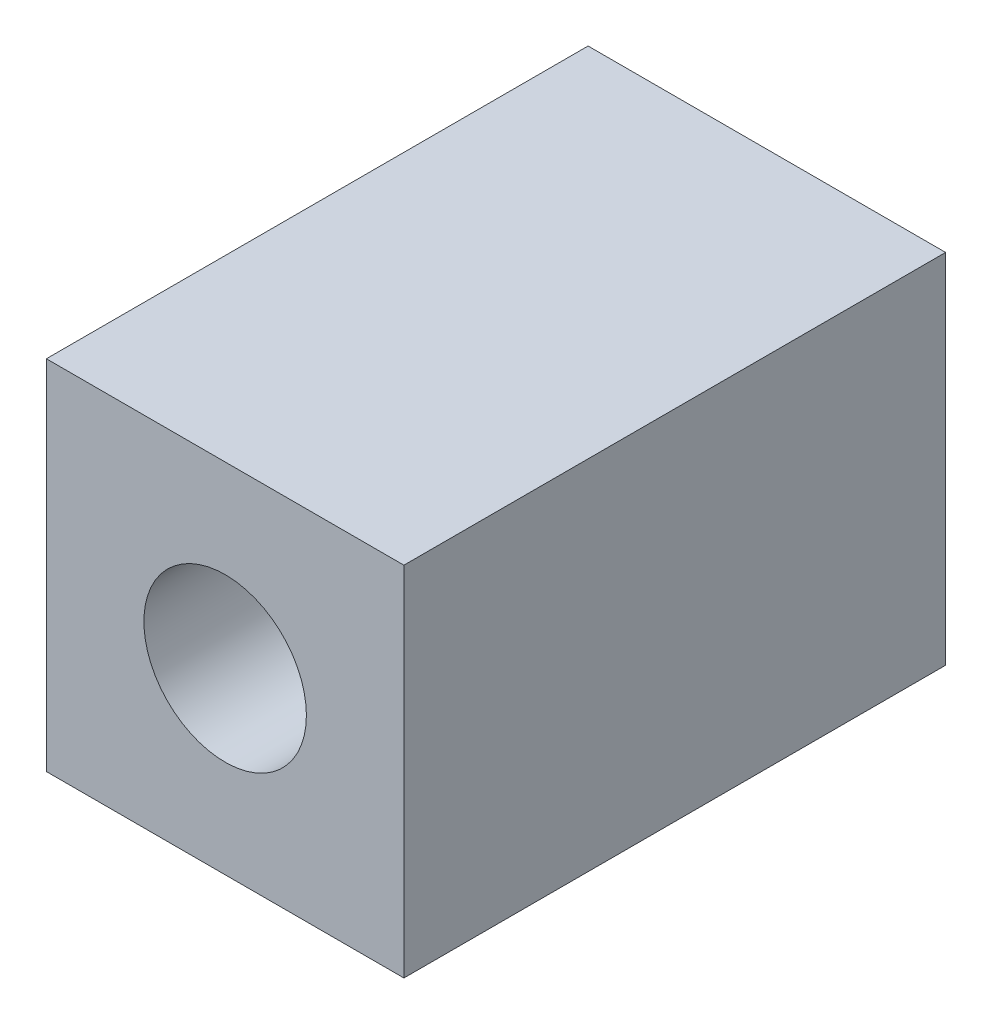
ISO-10303-21;
HEADER;
FILE_DESCRIPTION(('STEP AP214'),'2;1');
FILE_NAME('part.step','',(''),(''),'','','');
FILE_SCHEMA(('AUTOMOTIVE_DESIGN { 1 0 10303 214 1 1 1 1 }'));
ENDSEC;
DATA;
#1=APPLICATION_CONTEXT('core data for automotive mechanical design processes');
#2=APPLICATION_PROTOCOL_DEFINITION('international standard','automotive_design',2000,#1);
#3=PRODUCT_CONTEXT('',#1,'mechanical');
#4=PRODUCT('Part','Part','',(#3));
#5=PRODUCT_RELATED_PRODUCT_CATEGORY('part','',(#4));
#6=PRODUCT_DEFINITION_FORMATION('','',#4);
#7=PRODUCT_DEFINITION_CONTEXT('part definition',#1,'design');
#8=PRODUCT_DEFINITION('design','',#6,#7);
#9=PRODUCT_DEFINITION_SHAPE('','',#8);
#10=(LENGTH_UNIT() NAMED_UNIT(*) SI_UNIT(.MILLI.,.METRE.));
#11=(NAMED_UNIT(*) PLANE_ANGLE_UNIT() SI_UNIT($,.RADIAN.));
#12=(NAMED_UNIT(*) SI_UNIT($,.STERADIAN.) SOLID_ANGLE_UNIT());
#13=UNCERTAINTY_MEASURE_WITH_UNIT(LENGTH_MEASURE(1.E-05),#10,'distance_accuracy_value','');
#14=(GEOMETRIC_REPRESENTATION_CONTEXT(3) GLOBAL_UNCERTAINTY_ASSIGNED_CONTEXT((#13)) GLOBAL_UNIT_ASSIGNED_CONTEXT((#10,
#11,#12)) REPRESENTATION_CONTEXT('',''));
#15=CARTESIAN_POINT('',(0.,0.,0.));
#16=DIRECTION('',(0.,0.,1.));
#17=DIRECTION('',(1.,0.,0.));
#18=AXIS2_PLACEMENT_3D('',#15,#16,#17);
#19=CARTESIAN_POINT('',(-20.8921237018409,4.38053097345133,10.));
#20=DIRECTION('',(1.,0.,0.));
#21=DIRECTION('',(0.,0.,-1.));
#22=AXIS2_PLACEMENT_3D('',#19,#20,#21);
#23=PLANE('',#22);
#24=DIRECTION('',(0.,-1.,0.));
#25=VECTOR('',#24,1.);
#26=CARTESIAN_POINT('',(-20.8921237018409,4.38053097345133,0.));
#27=LINE('',#26,#25);
#28=CARTESIAN_POINT('',(-20.8921237018409,4.38053097345133,0.));
#29=VERTEX_POINT('',#28);
#30=CARTESIAN_POINT('',(-20.8921237018409,-2.21946902654867,0.));
#31=VERTEX_POINT('',#30);
#32=EDGE_CURVE('E148',#29,#31,#27,.T.);
#33=ORIENTED_EDGE('',*,*,#32,.T.);
#34=DIRECTION('',(0.,0.,-1.));
#35=VECTOR('',#34,1.);
#36=CARTESIAN_POINT('',(-20.8921237018409,-2.21946902654867,10.));
#37=LINE('',#36,#35);
#38=CARTESIAN_POINT('',(-20.8921237018409,-2.21946902654867,10.));
#39=VERTEX_POINT('',#38);
#40=EDGE_CURVE('E11',#39,#31,#37,.T.);
#41=ORIENTED_EDGE('',*,*,#40,.F.);
#42=DIRECTION('',(0.,-1.,0.));
#43=VECTOR('',#42,1.);
#44=CARTESIAN_POINT('',(-20.8921237018409,4.38053097345133,10.));
#45=LINE('',#44,#43);
#46=CARTESIAN_POINT('',(-20.8921237018409,4.38053097345133,10.));
#47=VERTEX_POINT('',#46);
#48=EDGE_CURVE('E151',#47,#39,#45,.T.);
#49=ORIENTED_EDGE('',*,*,#48,.F.);
#50=DIRECTION('',(0.,0.,-1.));
#51=VECTOR('',#50,1.);
#52=CARTESIAN_POINT('',(-20.8921237018409,4.38053097345133,10.));
#53=LINE('',#52,#51);
#54=EDGE_CURVE('E157',#47,#29,#53,.T.);
#55=ORIENTED_EDGE('',*,*,#54,.T.);
#56=EDGE_LOOP('',(#33,#41,#49,#55));
#57=FACE_BOUND('',#56,.T.);
#58=ADVANCED_FACE('F33',(#57),#23,.F.);
#59=CARTESIAN_POINT('',(-20.8921237018409,-2.21946902654867,10.));
#60=DIRECTION('',(0.,1.,0.));
#61=DIRECTION('',(0.,0.,1.));
#62=AXIS2_PLACEMENT_3D('',#59,#60,#61);
#63=PLANE('',#62);
#64=DIRECTION('',(1.,0.,0.));
#65=VECTOR('',#64,1.);
#66=CARTESIAN_POINT('',(-20.8921237018409,-2.21946902654867,0.));
#67=LINE('',#66,#65);
#68=CARTESIAN_POINT('',(-14.2921237018409,-2.21946902654867,0.));
#69=VERTEX_POINT('',#68);
#70=EDGE_CURVE('E160',#31,#69,#67,.T.);
#71=ORIENTED_EDGE('',*,*,#70,.T.);
#72=DIRECTION('',(0.,0.,-1.));
#73=VECTOR('',#72,1.);
#74=CARTESIAN_POINT('',(-14.2921237018409,-2.21946902654867,10.));
#75=LINE('',#74,#73);
#76=CARTESIAN_POINT('',(-14.2921237018409,-2.21946902654867,10.));
#77=VERTEX_POINT('',#76);
#78=EDGE_CURVE('E40',#77,#69,#75,.T.);
#79=ORIENTED_EDGE('',*,*,#78,.F.);
#80=DIRECTION('',(1.,0.,0.));
#81=VECTOR('',#80,1.);
#82=CARTESIAN_POINT('',(-20.8921237018409,-2.21946902654867,10.));
#83=LINE('',#82,#81);
#84=EDGE_CURVE('E84',#39,#77,#83,.T.);
#85=ORIENTED_EDGE('',*,*,#84,.F.);
#86=ORIENTED_EDGE('',*,*,#40,.T.);
#87=EDGE_LOOP('',(#71,#79,#85,#86));
#88=FACE_BOUND('',#87,.T.);
#89=ADVANCED_FACE('F189',(#88),#63,.F.);
#90=CARTESIAN_POINT('',(-14.2921237018409,4.38053097345133,10.));
#91=DIRECTION('',(-1.,0.,0.));
#92=DIRECTION('',(0.,-1.,0.));
#93=AXIS2_PLACEMENT_3D('',#90,#91,#92);
#94=PLANE('',#93);
#95=DIRECTION('',(0.,1.,0.));
#96=VECTOR('',#95,1.);
#97=CARTESIAN_POINT('',(-14.2921237018409,4.38053097345133,0.));
#98=LINE('',#97,#96);
#99=CARTESIAN_POINT('',(-14.2921237018409,4.38053097345133,0.));
#100=VERTEX_POINT('',#99);
#101=EDGE_CURVE('E162',#69,#100,#98,.T.);
#102=ORIENTED_EDGE('',*,*,#101,.T.);
#103=DIRECTION('',(0.,0.,-1.));
#104=VECTOR('',#103,1.);
#105=CARTESIAN_POINT('',(-14.2921237018409,4.38053097345133,10.));
#106=LINE('',#105,#104);
#107=CARTESIAN_POINT('',(-14.2921237018409,4.38053097345133,10.));
#108=VERTEX_POINT('',#107);
#109=EDGE_CURVE('E166',#108,#100,#106,.T.);
#110=ORIENTED_EDGE('',*,*,#109,.F.);
#111=DIRECTION('',(0.,1.,0.));
#112=VECTOR('',#111,1.);
#113=CARTESIAN_POINT('',(-14.2921237018409,4.38053097345133,10.));
#114=LINE('',#113,#112);
#115=EDGE_CURVE('E154',#77,#108,#114,.T.);
#116=ORIENTED_EDGE('',*,*,#115,.F.);
#117=ORIENTED_EDGE('',*,*,#78,.T.);
#118=EDGE_LOOP('',(#102,#110,#116,#117));
#119=FACE_BOUND('',#118,.T.);
#120=ADVANCED_FACE('F171',(#119),#94,.F.);
#121=CARTESIAN_POINT('',(-20.8921237018409,4.38053097345133,10.));
#122=DIRECTION('',(0.,-1.,0.));
#123=DIRECTION('',(0.,0.,-1.));
#124=AXIS2_PLACEMENT_3D('',#121,#122,#123);
#125=PLANE('',#124);
#126=DIRECTION('',(-1.,0.,0.));
#127=VECTOR('',#126,1.);
#128=CARTESIAN_POINT('',(-20.8921237018409,4.38053097345133,0.));
#129=LINE('',#128,#127);
#130=EDGE_CURVE('E77',#100,#29,#129,.T.);
#131=ORIENTED_EDGE('',*,*,#130,.T.);
#132=ORIENTED_EDGE('',*,*,#54,.F.);
#133=DIRECTION('',(-1.,0.,0.));
#134=VECTOR('',#133,1.);
#135=CARTESIAN_POINT('',(-20.8921237018409,4.38053097345133,10.));
#136=LINE('',#135,#134);
#137=EDGE_CURVE('E56',#108,#47,#136,.T.);
#138=ORIENTED_EDGE('',*,*,#137,.F.);
#139=ORIENTED_EDGE('',*,*,#109,.T.);
#140=EDGE_LOOP('',(#131,#132,#138,#139));
#141=FACE_BOUND('',#140,.T.);
#142=ADVANCED_FACE('F179',(#141),#125,.F.);
#143=CARTESIAN_POINT('',(0.,0.,10.));
#144=DIRECTION('',(0.,0.,1.));
#145=DIRECTION('',(1.,0.,0.));
#146=AXIS2_PLACEMENT_3D('',#143,#144,#145);
#147=PLANE('',#146);
#148=CARTESIAN_POINT('',(-17.5921237018409,1.08053097345133,10.));
#149=DIRECTION('',(0.,0.,1.));
#150=DIRECTION('',(1.,0.,0.));
#151=AXIS2_PLACEMENT_3D('',#148,#149,#150);
#152=CIRCLE('',#151,1.5);
#153=CARTESIAN_POINT('',(-16.0921237018409,1.08053097345133,10.));
#154=VERTEX_POINT('',#153);
#155=EDGE_CURVE('E141',#154,#154,#152,.T.);
#156=ORIENTED_EDGE('',*,*,#155,.F.);
#157=EDGE_LOOP('',(#156));
#158=FACE_BOUND('',#157,.T.);
#159=ORIENTED_EDGE('',*,*,#48,.T.);
#160=ORIENTED_EDGE('',*,*,#84,.T.);
#161=ORIENTED_EDGE('',*,*,#115,.T.);
#162=ORIENTED_EDGE('',*,*,#137,.T.);
#163=EDGE_LOOP('',(#159,#160,#161,#162));
#164=FACE_BOUND('',#163,.T.);
#165=ADVANCED_FACE('F181',(#158,#164),#147,.T.);
#166=CARTESIAN_POINT('',(0.,0.,0.));
#167=DIRECTION('',(0.,0.,1.));
#168=DIRECTION('',(1.,0.,0.));
#169=AXIS2_PLACEMENT_3D('',#166,#167,#168);
#170=PLANE('',#169);
#171=DIRECTION('',(1.,0.,0.));
#172=VECTOR('',#171,1.);
#173=CARTESIAN_POINT('',(-15.9921237018409,2.68053097345133,0.));
#174=LINE('',#173,#172);
#175=CARTESIAN_POINT('',(-19.1921237018409,2.68053097345133,0.));
#176=VERTEX_POINT('',#175);
#177=CARTESIAN_POINT('',(-15.9921237018409,2.68053097345133,0.));
#178=VERTEX_POINT('',#177);
#179=EDGE_CURVE('E135',#176,#178,#174,.T.);
#180=ORIENTED_EDGE('',*,*,#179,.F.);
#181=DIRECTION('',(0.,1.,0.));
#182=VECTOR('',#181,1.);
#183=CARTESIAN_POINT('',(-19.1921237018409,2.68053097345133,0.));
#184=LINE('',#183,#182);
#185=CARTESIAN_POINT('',(-19.1921237018409,-0.519469026548671,0.));
#186=VERTEX_POINT('',#185);
#187=EDGE_CURVE('E47',#186,#176,#184,.T.);
#188=ORIENTED_EDGE('',*,*,#187,.F.);
#189=DIRECTION('',(-1.,0.,0.));
#190=VECTOR('',#189,1.);
#191=CARTESIAN_POINT('',(-15.9921237018409,-0.519469026548671,0.));
#192=LINE('',#191,#190);
#193=CARTESIAN_POINT('',(-15.9921237018409,-0.519469026548671,0.));
#194=VERTEX_POINT('',#193);
#195=EDGE_CURVE('E126',#194,#186,#192,.T.);
#196=ORIENTED_EDGE('',*,*,#195,.F.);
#197=DIRECTION('',(0.,-1.,0.));
#198=VECTOR('',#197,1.);
#199=CARTESIAN_POINT('',(-15.9921237018409,2.68053097345133,0.));
#200=LINE('',#199,#198);
#201=EDGE_CURVE('E129',#178,#194,#200,.T.);
#202=ORIENTED_EDGE('',*,*,#201,.F.);
#203=EDGE_LOOP('',(#180,#188,#196,#202));
#204=FACE_BOUND('',#203,.T.);
#205=ORIENTED_EDGE('',*,*,#32,.F.);
#206=ORIENTED_EDGE('',*,*,#130,.F.);
#207=ORIENTED_EDGE('',*,*,#101,.F.);
#208=ORIENTED_EDGE('',*,*,#70,.F.);
#209=EDGE_LOOP('',(#205,#206,#207,#208));
#210=FACE_BOUND('',#209,.T.);
#211=ADVANCED_FACE('F175',(#204,#210),#170,.F.);
#212=CARTESIAN_POINT('',(-17.5921237018409,1.08053097345133,6.));
#213=DIRECTION('',(0.,0.,1.));
#214=DIRECTION('',(1.,0.,0.));
#215=AXIS2_PLACEMENT_3D('',#212,#213,#214);
#216=CYLINDRICAL_SURFACE('',#215,1.5);
#217=CARTESIAN_POINT('',(-17.5921237018409,1.08053097345133,6.));
#218=DIRECTION('',(0.,0.,1.));
#219=DIRECTION('',(1.,0.,0.));
#220=AXIS2_PLACEMENT_3D('',#217,#218,#219);
#221=CIRCLE('',#220,1.5);
#222=CARTESIAN_POINT('',(-16.0921237018409,1.08053097345133,6.));
#223=VERTEX_POINT('',#222);
#224=EDGE_CURVE('E145',#223,#223,#221,.T.);
#225=ORIENTED_EDGE('',*,*,#224,.F.);
#226=EDGE_LOOP('',(#225));
#227=FACE_BOUND('',#226,.T.);
#228=ORIENTED_EDGE('',*,*,#155,.T.);
#229=EDGE_LOOP('',(#228));
#230=FACE_BOUND('',#229,.T.);
#231=ADVANCED_FACE('F219',(#227,#230),#216,.F.);
#232=CARTESIAN_POINT('',(-17.5921237018409,1.08053097345133,6.));
#233=DIRECTION('',(0.,0.,1.));
#234=DIRECTION('',(1.,0.,0.));
#235=AXIS2_PLACEMENT_3D('',#232,#233,#234);
#236=PLANE('',#235);
#237=ORIENTED_EDGE('',*,*,#224,.T.);
#238=EDGE_LOOP('',(#237));
#239=FACE_BOUND('',#238,.T.);
#240=ADVANCED_FACE('F224',(#239),#236,.T.);
#241=CARTESIAN_POINT('',(-19.1921237018409,2.68053097345133,4.));
#242=DIRECTION('',(-1.,0.,0.));
#243=DIRECTION('',(0.,0.,1.));
#244=AXIS2_PLACEMENT_3D('',#241,#242,#243);
#245=PLANE('',#244);
#246=ORIENTED_EDGE('',*,*,#187,.T.);
#247=DIRECTION('',(0.,0.,-1.));
#248=VECTOR('',#247,1.);
#249=CARTESIAN_POINT('',(-19.1921237018409,2.68053097345133,4.));
#250=LINE('',#249,#248);
#251=CARTESIAN_POINT('',(-19.1921237018409,2.68053097345133,4.));
#252=VERTEX_POINT('',#251);
#253=EDGE_CURVE('E104',#252,#176,#250,.T.);
#254=ORIENTED_EDGE('',*,*,#253,.F.);
#255=DIRECTION('',(0.,1.,0.));
#256=VECTOR('',#255,1.);
#257=CARTESIAN_POINT('',(-19.1921237018409,2.68053097345133,4.));
#258=LINE('',#257,#256);
#259=CARTESIAN_POINT('',(-19.1921237018409,-0.519469026548671,4.));
#260=VERTEX_POINT('',#259);
#261=EDGE_CURVE('E108',#260,#252,#258,.T.);
#262=ORIENTED_EDGE('',*,*,#261,.F.);
#263=DIRECTION('',(0.,0.,-1.));
#264=VECTOR('',#263,1.);
#265=CARTESIAN_POINT('',(-19.1921237018409,-0.519469026548671,4.));
#266=LINE('',#265,#264);
#267=EDGE_CURVE('E139',#260,#186,#266,.T.);
#268=ORIENTED_EDGE('',*,*,#267,.T.);
#269=EDGE_LOOP('',(#246,#254,#262,#268));
#270=FACE_BOUND('',#269,.T.);
#271=ADVANCED_FACE('F106',(#270),#245,.F.);
#272=CARTESIAN_POINT('',(-15.9921237018409,-0.519469026548671,4.));
#273=DIRECTION('',(0.,-1.,0.));
#274=DIRECTION('',(0.,0.,-1.));
#275=AXIS2_PLACEMENT_3D('',#272,#273,#274);
#276=PLANE('',#275);
#277=ORIENTED_EDGE('',*,*,#195,.T.);
#278=ORIENTED_EDGE('',*,*,#267,.F.);
#279=DIRECTION('',(-1.,0.,0.));
#280=VECTOR('',#279,1.);
#281=CARTESIAN_POINT('',(-15.9921237018409,-0.519469026548671,4.));
#282=LINE('',#281,#280);
#283=CARTESIAN_POINT('',(-15.9921237018409,-0.519469026548671,4.));
#284=VERTEX_POINT('',#283);
#285=EDGE_CURVE('E114',#284,#260,#282,.T.);
#286=ORIENTED_EDGE('',*,*,#285,.F.);
#287=DIRECTION('',(0.,0.,-1.));
#288=VECTOR('',#287,1.);
#289=CARTESIAN_POINT('',(-15.9921237018409,-0.519469026548671,4.));
#290=LINE('',#289,#288);
#291=EDGE_CURVE('E142',#284,#194,#290,.T.);
#292=ORIENTED_EDGE('',*,*,#291,.T.);
#293=EDGE_LOOP('',(#277,#278,#286,#292));
#294=FACE_BOUND('',#293,.T.);
#295=ADVANCED_FACE('F249',(#294),#276,.F.);
#296=CARTESIAN_POINT('',(-15.9921237018409,2.68053097345133,4.));
#297=DIRECTION('',(1.,0.,0.));
#298=DIRECTION('',(0.,0.,-1.));
#299=AXIS2_PLACEMENT_3D('',#296,#297,#298);
#300=PLANE('',#299);
#301=ORIENTED_EDGE('',*,*,#201,.T.);
#302=ORIENTED_EDGE('',*,*,#291,.F.);
#303=DIRECTION('',(0.,-1.,0.));
#304=VECTOR('',#303,1.);
#305=CARTESIAN_POINT('',(-15.9921237018409,2.68053097345133,4.));
#306=LINE('',#305,#304);
#307=CARTESIAN_POINT('',(-15.9921237018409,2.68053097345133,4.));
#308=VERTEX_POINT('',#307);
#309=EDGE_CURVE('E122',#308,#284,#306,.T.);
#310=ORIENTED_EDGE('',*,*,#309,.F.);
#311=DIRECTION('',(0.,0.,-1.));
#312=VECTOR('',#311,1.);
#313=CARTESIAN_POINT('',(-15.9921237018409,2.68053097345133,4.));
#314=LINE('',#313,#312);
#315=EDGE_CURVE('E113',#308,#178,#314,.T.);
#316=ORIENTED_EDGE('',*,*,#315,.T.);
#317=EDGE_LOOP('',(#301,#302,#310,#316));
#318=FACE_BOUND('',#317,.T.);
#319=ADVANCED_FACE('F258',(#318),#300,.F.);
#320=CARTESIAN_POINT('',(-15.9921237018409,2.68053097345133,4.));
#321=DIRECTION('',(0.,1.,0.));
#322=DIRECTION('',(0.,0.,1.));
#323=AXIS2_PLACEMENT_3D('',#320,#321,#322);
#324=PLANE('',#323);
#325=ORIENTED_EDGE('',*,*,#179,.T.);
#326=ORIENTED_EDGE('',*,*,#315,.F.);
#327=DIRECTION('',(1.,0.,0.));
#328=VECTOR('',#327,1.);
#329=CARTESIAN_POINT('',(-15.9921237018409,2.68053097345133,4.));
#330=LINE('',#329,#328);
#331=EDGE_CURVE('E117',#252,#308,#330,.T.);
#332=ORIENTED_EDGE('',*,*,#331,.F.);
#333=ORIENTED_EDGE('',*,*,#253,.T.);
#334=EDGE_LOOP('',(#325,#326,#332,#333));
#335=FACE_BOUND('',#334,.T.);
#336=ADVANCED_FACE('F118',(#335),#324,.F.);
#337=CARTESIAN_POINT('',(0.,0.,4.));
#338=DIRECTION('',(0.,0.,-1.));
#339=DIRECTION('',(-1.,0.,0.));
#340=AXIS2_PLACEMENT_3D('',#337,#338,#339);
#341=PLANE('',#340);
#342=ORIENTED_EDGE('',*,*,#261,.T.);
#343=ORIENTED_EDGE('',*,*,#331,.T.);
#344=ORIENTED_EDGE('',*,*,#309,.T.);
#345=ORIENTED_EDGE('',*,*,#285,.T.);
#346=EDGE_LOOP('',(#342,#343,#344,#345));
#347=FACE_BOUND('',#346,.T.);
#348=ADVANCED_FACE('F124',(#347),#341,.T.);
#349=CLOSED_SHELL('',(#58,#89,#120,#142,#165,#211,#231,#240,#271,#295,#319,#336,#348));
#350=MANIFOLD_SOLID_BREP('B2',#349);
#351=ADVANCED_BREP_SHAPE_REPRESENTATION('',(#18,#350),#14);
#352=SHAPE_DEFINITION_REPRESENTATION(#9,#351);
ENDSEC;
END-ISO-10303-21;
